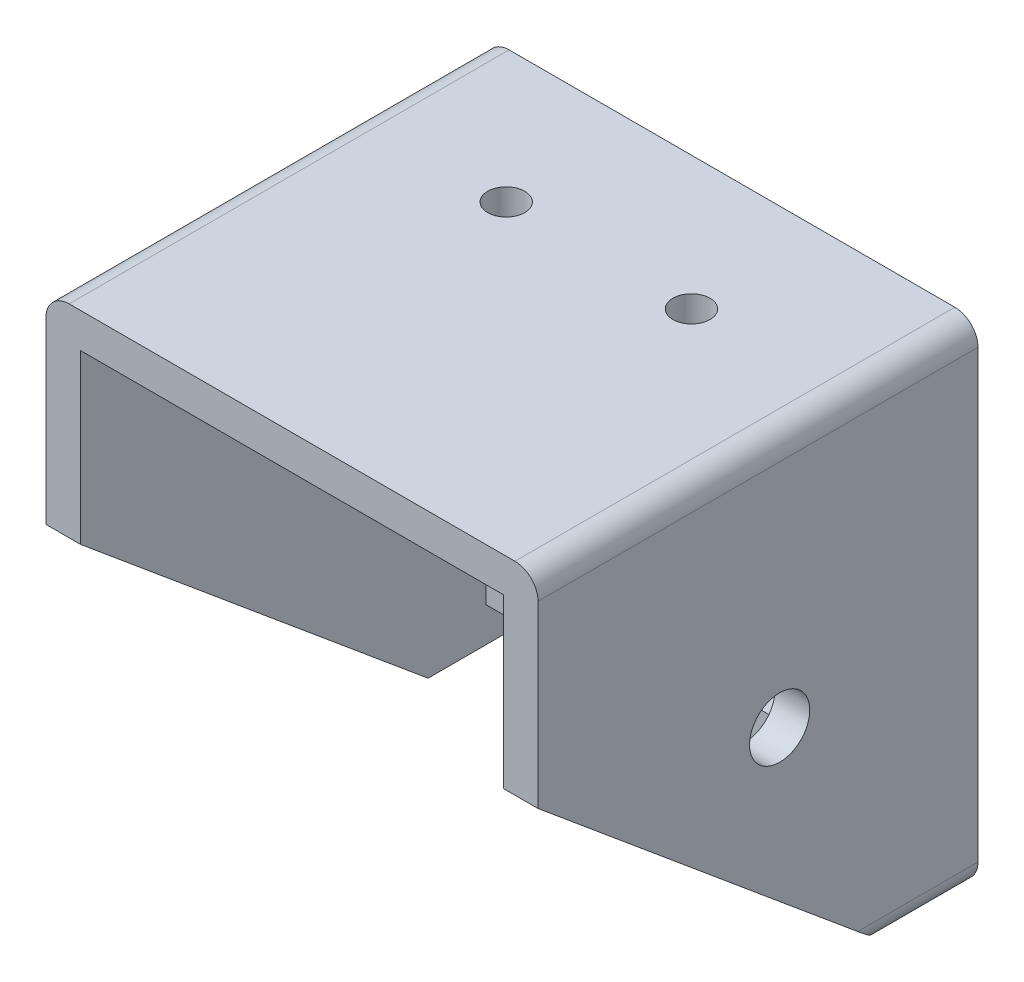
ISO-10303-21;
HEADER;
FILE_DESCRIPTION(('STEP AP214'),'2;1');
FILE_NAME('part.step','',(''),(''),'','','');
FILE_SCHEMA(('AUTOMOTIVE_DESIGN { 1 0 10303 214 1 1 1 1 }'));
ENDSEC;
DATA;
#1=APPLICATION_CONTEXT('core data for automotive mechanical design processes');
#2=APPLICATION_PROTOCOL_DEFINITION('international standard','automotive_design',2000,#1);
#3=PRODUCT_CONTEXT('',#1,'mechanical');
#4=PRODUCT('Part','Part','',(#3));
#5=PRODUCT_RELATED_PRODUCT_CATEGORY('part','',(#4));
#6=PRODUCT_DEFINITION_FORMATION('','',#4);
#7=PRODUCT_DEFINITION_CONTEXT('part definition',#1,'design');
#8=PRODUCT_DEFINITION('design','',#6,#7);
#9=PRODUCT_DEFINITION_SHAPE('','',#8);
#10=(LENGTH_UNIT() NAMED_UNIT(*) SI_UNIT(.MILLI.,.METRE.));
#11=(NAMED_UNIT(*) PLANE_ANGLE_UNIT() SI_UNIT($,.RADIAN.));
#12=(NAMED_UNIT(*) SI_UNIT($,.STERADIAN.) SOLID_ANGLE_UNIT());
#13=UNCERTAINTY_MEASURE_WITH_UNIT(LENGTH_MEASURE(1.E-05),#10,'distance_accuracy_value','');
#14=(GEOMETRIC_REPRESENTATION_CONTEXT(3) GLOBAL_UNCERTAINTY_ASSIGNED_CONTEXT((#13)) GLOBAL_UNIT_ASSIGNED_CONTEXT((#10,
#11,#12)) REPRESENTATION_CONTEXT('',''));
#15=CARTESIAN_POINT('',(0.,0.,0.));
#16=DIRECTION('',(0.,0.,1.));
#17=DIRECTION('',(1.,0.,0.));
#18=AXIS2_PLACEMENT_3D('',#15,#16,#17);
#19=CARTESIAN_POINT('',(29.5,-7.,3.));
#20=DIRECTION('',(0.,1.,0.));
#21=DIRECTION('',(0.,0.,1.));
#22=AXIS2_PLACEMENT_3D('',#19,#20,#21);
#23=PLANE('',#22);
#24=DIRECTION('',(0.,0.,-1.));
#25=VECTOR('',#24,1.);
#26=CARTESIAN_POINT('',(-4.99999999999999,-7.00000000000001,3.));
#27=LINE('',#26,#25);
#28=CARTESIAN_POINT('',(-4.99999999999999,-7.00000000000001,7.99999999999999));
#29=VERTEX_POINT('',#28);
#30=CARTESIAN_POINT('',(-4.99999999999999,-7.00000000000001,0.));
#31=VERTEX_POINT('',#30);
#32=EDGE_CURVE('E372',#29,#31,#27,.T.);
#33=ORIENTED_EDGE('',*,*,#32,.F.);
#34=DIRECTION('',(-1.,0.,0.));
#35=VECTOR('',#34,1.);
#36=CARTESIAN_POINT('',(37.,-7.,8.));
#37=LINE('',#36,#35);
#38=CARTESIAN_POINT('',(-6.,-7.,8.));
#39=VERTEX_POINT('',#38);
#40=EDGE_CURVE('E276',#29,#39,#37,.T.);
#41=ORIENTED_EDGE('',*,*,#40,.T.);
#42=DIRECTION('',(0.,0.,-1.));
#43=VECTOR('',#42,1.);
#44=CARTESIAN_POINT('',(-6.,-7.,3.));
#45=LINE('',#44,#43);
#46=CARTESIAN_POINT('',(-6.,-7.,0.));
#47=VERTEX_POINT('',#46);
#48=EDGE_CURVE('E228',#39,#47,#45,.T.);
#49=ORIENTED_EDGE('',*,*,#48,.T.);
#50=DIRECTION('',(1.,0.,0.));
#51=VECTOR('',#50,1.);
#52=CARTESIAN_POINT('',(29.5,-7.,0.));
#53=LINE('',#52,#51);
#54=EDGE_CURVE('E204',#47,#31,#53,.T.);
#55=ORIENTED_EDGE('',*,*,#54,.T.);
#56=EDGE_LOOP('',(#33,#41,#49,#55));
#57=FACE_BOUND('',#56,.T.);
#58=ADVANCED_FACE('F35',(#57),#23,.F.);
#59=CARTESIAN_POINT('',(37.,-7.,8.));
#60=DIRECTION('',(0.,0.768221279597376,-0.64018439966448));
#61=DIRECTION('',(0.,0.64018439966448,0.768221279597376));
#62=AXIS2_PLACEMENT_3D('',#59,#60,#61);
#63=PLANE('',#62);
#64=ORIENTED_EDGE('',*,*,#40,.F.);
#65=DIRECTION('',(0.,0.64018439966448,0.768221279597376));
#66=VECTOR('',#65,1.);
#67=CARTESIAN_POINT('',(-4.99999999999999,8.98360655737705,27.1803278688525));
#68=LINE('',#67,#66);
#69=CARTESIAN_POINT('',(-4.99999999999999,18.,38.));
#70=VERTEX_POINT('',#69);
#71=EDGE_CURVE('E275',#29,#70,#68,.T.);
#72=ORIENTED_EDGE('',*,*,#71,.T.);
#73=DIRECTION('',(-1.,0.,0.));
#74=VECTOR('',#73,1.);
#75=CARTESIAN_POINT('',(37.,18.,38.));
#76=LINE('',#75,#74);
#77=CARTESIAN_POINT('',(-8.,18.,38.));
#78=VERTEX_POINT('',#77);
#79=EDGE_CURVE('E273',#70,#78,#76,.T.);
#80=ORIENTED_EDGE('',*,*,#79,.T.);
#81=DIRECTION('',(0.,-0.64018439966448,-0.768221279597376));
#82=VECTOR('',#81,1.);
#83=CARTESIAN_POINT('',(-8.,-7.,8.));
#84=LINE('',#83,#82);
#85=CARTESIAN_POINT('',(-8.,-5.,10.4));
#86=VERTEX_POINT('',#85);
#87=EDGE_CURVE('E225',#78,#86,#84,.T.);
#88=ORIENTED_EDGE('',*,*,#87,.T.);
#89=CARTESIAN_POINT('',(-6.,-5.,10.4));
#90=DIRECTION('',(0.,0.768221279597376,-0.64018439966448));
#91=DIRECTION('',(0.,-0.64018439966448,-0.768221279597376));
#92=AXIS2_PLACEMENT_3D('',#89,#90,#91);
#93=ELLIPSE('',#92,3.12409987036266,2.);
#94=EDGE_CURVE('E245',#86,#39,#93,.F.);
#95=ORIENTED_EDGE('',*,*,#94,.T.);
#96=EDGE_LOOP('',(#64,#72,#80,#88,#95));
#97=FACE_BOUND('',#96,.T.);
#98=ADVANCED_FACE('F366',(#97),#63,.F.);
#99=CARTESIAN_POINT('',(0.,0.,3.));
#100=DIRECTION('',(0.,0.,1.));
#101=DIRECTION('',(1.,0.,0.));
#102=AXIS2_PLACEMENT_3D('',#99,#100,#101);
#103=PLANE('',#102);
#104=DIRECTION('',(0.,1.,0.));
#105=VECTOR('',#104,1.);
#106=CARTESIAN_POINT('',(31.5,32.5,3.));
#107=LINE('',#106,#105);
#108=CARTESIAN_POINT('',(31.5,-4.00000000000001,3.));
#109=VERTEX_POINT('',#108);
#110=CARTESIAN_POINT('',(31.5,32.5,3.));
#111=VERTEX_POINT('',#110);
#112=EDGE_CURVE('E190',#109,#111,#107,.T.);
#113=ORIENTED_EDGE('',*,*,#112,.T.);
#114=DIRECTION('',(-1.,0.,0.));
#115=VECTOR('',#114,1.);
#116=CARTESIAN_POINT('',(-4.99999999999999,32.5,3.));
#117=LINE('',#116,#115);
#118=CARTESIAN_POINT('',(-4.99999999999999,32.5,3.));
#119=VERTEX_POINT('',#118);
#120=EDGE_CURVE('E296',#111,#119,#117,.T.);
#121=ORIENTED_EDGE('',*,*,#120,.T.);
#122=DIRECTION('',(0.,-1.,0.));
#123=VECTOR('',#122,1.);
#124=CARTESIAN_POINT('',(-4.99999999999999,-4.00000000000001,3.));
#125=LINE('',#124,#123);
#126=CARTESIAN_POINT('',(-4.99999999999999,-4.00000000000001,3.));
#127=VERTEX_POINT('',#126);
#128=EDGE_CURVE('E298',#119,#127,#125,.T.);
#129=ORIENTED_EDGE('',*,*,#128,.T.);
#130=DIRECTION('',(1.,0.,0.));
#131=VECTOR('',#130,1.);
#132=CARTESIAN_POINT('',(31.5,-4.,3.));
#133=LINE('',#132,#131);
#134=EDGE_CURVE('E289',#127,#109,#133,.T.);
#135=ORIENTED_EDGE('',*,*,#134,.T.);
#136=EDGE_LOOP('',(#113,#121,#129,#135));
#137=FACE_BOUND('',#136,.T.);
#138=CARTESIAN_POINT('',(23.25,25.5,3.));
#139=DIRECTION('',(0.,0.,1.));
#140=DIRECTION('',(1.,0.,0.));
#141=AXIS2_PLACEMENT_3D('',#138,#139,#140);
#142=CIRCLE('',#141,6.);
#143=CARTESIAN_POINT('',(29.25,25.5,3.));
#144=VERTEX_POINT('',#143);
#145=EDGE_CURVE('E221',#144,#144,#142,.T.);
#146=ORIENTED_EDGE('',*,*,#145,.F.);
#147=EDGE_LOOP('',(#146));
#148=FACE_BOUND('',#147,.T.);
#149=CARTESIAN_POINT('',(3.25,25.5,3.));
#150=DIRECTION('',(0.,0.,1.));
#151=DIRECTION('',(1.,0.,0.));
#152=AXIS2_PLACEMENT_3D('',#149,#150,#151);
#153=CIRCLE('',#152,6.);
#154=CARTESIAN_POINT('',(9.25,25.5,3.));
#155=VERTEX_POINT('',#154);
#156=EDGE_CURVE('E217',#155,#155,#153,.T.);
#157=ORIENTED_EDGE('',*,*,#156,.F.);
#158=EDGE_LOOP('',(#157));
#159=FACE_BOUND('',#158,.T.);
#160=DIRECTION('',(0.,1.,0.));
#161=VECTOR('',#160,1.);
#162=CARTESIAN_POINT('',(26.5,14.5,3.));
#163=LINE('',#162,#161);
#164=CARTESIAN_POINT('',(26.5,0.,3.));
#165=VERTEX_POINT('',#164);
#166=CARTESIAN_POINT('',(26.5,14.5,3.));
#167=VERTEX_POINT('',#166);
#168=EDGE_CURVE('E318',#165,#167,#163,.T.);
#169=ORIENTED_EDGE('',*,*,#168,.F.);
#170=DIRECTION('',(1.,0.,0.));
#171=VECTOR('',#170,1.);
#172=CARTESIAN_POINT('',(0.,0.,3.));
#173=LINE('',#172,#171);
#174=CARTESIAN_POINT('',(0.,0.,3.));
#175=VERTEX_POINT('',#174);
#176=EDGE_CURVE('E316',#175,#165,#173,.T.);
#177=ORIENTED_EDGE('',*,*,#176,.F.);
#178=DIRECTION('',(0.,-1.,0.));
#179=VECTOR('',#178,1.);
#180=CARTESIAN_POINT('',(0.,0.,3.));
#181=LINE('',#180,#179);
#182=CARTESIAN_POINT('',(0.,14.5,3.));
#183=VERTEX_POINT('',#182);
#184=EDGE_CURVE('E324',#183,#175,#181,.T.);
#185=ORIENTED_EDGE('',*,*,#184,.F.);
#186=DIRECTION('',(-1.,0.,0.));
#187=VECTOR('',#186,1.);
#188=CARTESIAN_POINT('',(0.,14.5,3.));
#189=LINE('',#188,#187);
#190=EDGE_CURVE('E321',#167,#183,#189,.T.);
#191=ORIENTED_EDGE('',*,*,#190,.F.);
#192=EDGE_LOOP('',(#169,#177,#185,#191));
#193=FACE_BOUND('',#192,.T.);
#194=ADVANCED_FACE('F389',(#137,#148,#159,#193),#103,.T.);
#195=CARTESIAN_POINT('',(0.,0.,0.));
#196=DIRECTION('',(0.,0.,1.));
#197=DIRECTION('',(1.,0.,0.));
#198=AXIS2_PLACEMENT_3D('',#195,#196,#197);
#199=PLANE('',#198);
#200=CARTESIAN_POINT('',(23.25,25.5,0.));
#201=DIRECTION('',(0.,0.,1.));
#202=DIRECTION('',(1.,0.,0.));
#203=AXIS2_PLACEMENT_3D('',#200,#201,#202);
#204=CIRCLE('',#203,6.);
#205=CARTESIAN_POINT('',(29.25,25.5,0.));
#206=VERTEX_POINT('',#205);
#207=EDGE_CURVE('E218',#206,#206,#204,.T.);
#208=ORIENTED_EDGE('',*,*,#207,.T.);
#209=EDGE_LOOP('',(#208));
#210=FACE_BOUND('',#209,.T.);
#211=CARTESIAN_POINT('',(3.25,25.5,0.));
#212=DIRECTION('',(0.,0.,1.));
#213=DIRECTION('',(1.,0.,0.));
#214=AXIS2_PLACEMENT_3D('',#211,#212,#213);
#215=CIRCLE('',#214,6.);
#216=CARTESIAN_POINT('',(9.25,25.5,0.));
#217=VERTEX_POINT('',#216);
#218=EDGE_CURVE('E213',#217,#217,#215,.T.);
#219=ORIENTED_EDGE('',*,*,#218,.T.);
#220=EDGE_LOOP('',(#219));
#221=FACE_BOUND('',#220,.T.);
#222=ORIENTED_EDGE('',*,*,#54,.F.);
#223=CARTESIAN_POINT('',(-6.,-5.,0.));
#224=DIRECTION('',(0.,0.,1.));
#225=DIRECTION('',(1.,0.,0.));
#226=AXIS2_PLACEMENT_3D('',#223,#224,#225);
#227=CIRCLE('',#226,2.);
#228=CARTESIAN_POINT('',(-8.,-5.,0.));
#229=VERTEX_POINT('',#228);
#230=EDGE_CURVE('E236',#47,#229,#227,.F.);
#231=ORIENTED_EDGE('',*,*,#230,.T.);
#232=DIRECTION('',(0.,-1.,0.));
#233=VECTOR('',#232,1.);
#234=CARTESIAN_POINT('',(-8.,35.5,0.));
#235=LINE('',#234,#233);
#236=CARTESIAN_POINT('',(-8.,33.5,0.));
#237=VERTEX_POINT('',#236);
#238=EDGE_CURVE('E205',#237,#229,#235,.T.);
#239=ORIENTED_EDGE('',*,*,#238,.F.);
#240=CARTESIAN_POINT('',(-6.,33.5,0.));
#241=DIRECTION('',(0.,0.,1.));
#242=DIRECTION('',(1.,0.,0.));
#243=AXIS2_PLACEMENT_3D('',#240,#241,#242);
#244=CIRCLE('',#243,2.);
#245=CARTESIAN_POINT('',(-6.,35.5,0.));
#246=VERTEX_POINT('',#245);
#247=EDGE_CURVE('E233',#237,#246,#244,.F.);
#248=ORIENTED_EDGE('',*,*,#247,.T.);
#249=DIRECTION('',(-1.,0.,0.));
#250=VECTOR('',#249,1.);
#251=CARTESIAN_POINT('',(-3.,35.5,0.));
#252=LINE('',#251,#250);
#253=CARTESIAN_POINT('',(32.5,35.5,0.));
#254=VERTEX_POINT('',#253);
#255=EDGE_CURVE('E209',#254,#246,#252,.T.);
#256=ORIENTED_EDGE('',*,*,#255,.F.);
#257=CARTESIAN_POINT('',(32.5,33.5,0.));
#258=DIRECTION('',(0.,0.,1.));
#259=DIRECTION('',(1.,0.,0.));
#260=AXIS2_PLACEMENT_3D('',#257,#258,#259);
#261=CIRCLE('',#260,2.);
#262=CARTESIAN_POINT('',(34.5,33.5,0.));
#263=VERTEX_POINT('',#262);
#264=EDGE_CURVE('E231',#254,#263,#261,.F.);
#265=ORIENTED_EDGE('',*,*,#264,.T.);
#266=DIRECTION('',(0.,1.,0.));
#267=VECTOR('',#266,1.);
#268=CARTESIAN_POINT('',(34.5,-7.,0.));
#269=LINE('',#268,#267);
#270=CARTESIAN_POINT('',(34.5,-5.,0.));
#271=VERTEX_POINT('',#270);
#272=EDGE_CURVE('E346',#271,#263,#269,.T.);
#273=ORIENTED_EDGE('',*,*,#272,.F.);
#274=CARTESIAN_POINT('',(32.5,-5.,0.));
#275=DIRECTION('',(0.,0.,1.));
#276=DIRECTION('',(1.,0.,0.));
#277=AXIS2_PLACEMENT_3D('',#274,#275,#276);
#278=CIRCLE('',#277,2.);
#279=CARTESIAN_POINT('',(32.5,-7.,0.));
#280=VERTEX_POINT('',#279);
#281=EDGE_CURVE('E202',#271,#280,#278,.F.);
#282=ORIENTED_EDGE('',*,*,#281,.T.);
#283=CARTESIAN_POINT('',(31.5,-7.00000000000001,0.));
#284=VERTEX_POINT('',#283);
#285=EDGE_CURVE('E194',#284,#280,#53,.T.);
#286=ORIENTED_EDGE('',*,*,#285,.F.);
#287=DIRECTION('',(-1.,0.,0.));
#288=VECTOR('',#287,1.);
#289=CARTESIAN_POINT('',(31.5,-7.00000000000001,0.));
#290=LINE('',#289,#288);
#291=EDGE_CURVE('E168',#284,#31,#290,.T.);
#292=ORIENTED_EDGE('',*,*,#291,.T.);
#293=EDGE_LOOP('',(#222,#231,#239,#248,#256,#265,#273,#282,#286,#292));
#294=FACE_BOUND('',#293,.T.);
#295=DIRECTION('',(1.,0.,0.));
#296=VECTOR('',#295,1.);
#297=CARTESIAN_POINT('',(0.,0.,0.));
#298=LINE('',#297,#296);
#299=CARTESIAN_POINT('',(0.,0.,0.));
#300=VERTEX_POINT('',#299);
#301=CARTESIAN_POINT('',(26.5,0.,0.));
#302=VERTEX_POINT('',#301);
#303=EDGE_CURVE('E216',#300,#302,#298,.T.);
#304=ORIENTED_EDGE('',*,*,#303,.T.);
#305=DIRECTION('',(0.,1.,0.));
#306=VECTOR('',#305,1.);
#307=CARTESIAN_POINT('',(26.5,14.5,0.));
#308=LINE('',#307,#306);
#309=CARTESIAN_POINT('',(26.5,14.5,0.));
#310=VERTEX_POINT('',#309);
#311=EDGE_CURVE('E329',#302,#310,#308,.T.);
#312=ORIENTED_EDGE('',*,*,#311,.T.);
#313=DIRECTION('',(-1.,0.,0.));
#314=VECTOR('',#313,1.);
#315=CARTESIAN_POINT('',(0.,14.5,0.));
#316=LINE('',#315,#314);
#317=CARTESIAN_POINT('',(0.,14.5,0.));
#318=VERTEX_POINT('',#317);
#319=EDGE_CURVE('E332',#310,#318,#316,.T.);
#320=ORIENTED_EDGE('',*,*,#319,.T.);
#321=DIRECTION('',(0.,-1.,0.));
#322=VECTOR('',#321,1.);
#323=CARTESIAN_POINT('',(0.,0.,0.));
#324=LINE('',#323,#322);
#325=EDGE_CURVE('E319',#318,#300,#324,.T.);
#326=ORIENTED_EDGE('',*,*,#325,.T.);
#327=EDGE_LOOP('',(#304,#312,#320,#326));
#328=FACE_BOUND('',#327,.T.);
#329=ADVANCED_FACE('F199',(#210,#221,#294,#328),#199,.F.);
#330=CARTESIAN_POINT('',(34.5,-7.,3.));
#331=DIRECTION('',(-1.,0.,0.));
#332=DIRECTION('',(0.,0.,1.));
#333=AXIS2_PLACEMENT_3D('',#330,#331,#332);
#334=PLANE('',#333);
#335=CARTESIAN_POINT('',(34.5,13.6272072376241,17.1321493333356));
#336=DIRECTION('',(1.,0.,0.));
#337=DIRECTION('',(0.,0.,-1.));
#338=AXIS2_PLACEMENT_3D('',#335,#336,#337);
#339=CIRCLE('',#338,2.6);
#340=CARTESIAN_POINT('',(34.5,13.6272072376241,14.5321493333356));
#341=VERTEX_POINT('',#340);
#342=EDGE_CURVE('E226',#341,#341,#339,.T.);
#343=ORIENTED_EDGE('',*,*,#342,.F.);
#344=EDGE_LOOP('',(#343));
#345=FACE_BOUND('',#344,.T.);
#346=DIRECTION('',(0.,-0.64018439966448,-0.768221279597376));
#347=VECTOR('',#346,1.);
#348=CARTESIAN_POINT('',(34.5,-9.45901639344262,5.04918032786885));
#349=LINE('',#348,#347);
#350=CARTESIAN_POINT('',(34.5,18.,38.));
#351=VERTEX_POINT('',#350);
#352=CARTESIAN_POINT('',(34.5,-5.,10.4));
#353=VERTEX_POINT('',#352);
#354=EDGE_CURVE('E283',#351,#353,#349,.T.);
#355=ORIENTED_EDGE('',*,*,#354,.T.);
#356=DIRECTION('',(0.,0.,-1.));
#357=VECTOR('',#356,1.);
#358=CARTESIAN_POINT('',(34.5,-5.,3.));
#359=LINE('',#358,#357);
#360=EDGE_CURVE('E250',#353,#271,#359,.T.);
#361=ORIENTED_EDGE('',*,*,#360,.T.);
#362=ORIENTED_EDGE('',*,*,#272,.T.);
#363=DIRECTION('',(0.,0.,-1.));
#364=VECTOR('',#363,1.);
#365=CARTESIAN_POINT('',(34.5,33.5,3.));
#366=LINE('',#365,#364);
#367=CARTESIAN_POINT('',(34.5,33.5,38.));
#368=VERTEX_POINT('',#367);
#369=EDGE_CURVE('E248',#263,#368,#366,.F.);
#370=ORIENTED_EDGE('',*,*,#369,.T.);
#371=DIRECTION('',(0.,1.,0.));
#372=VECTOR('',#371,1.);
#373=CARTESIAN_POINT('',(34.5,-7.,38.));
#374=LINE('',#373,#372);
#375=EDGE_CURVE('E310',#351,#368,#374,.T.);
#376=ORIENTED_EDGE('',*,*,#375,.F.);
#377=EDGE_LOOP('',(#355,#361,#362,#370,#376));
#378=FACE_BOUND('',#377,.T.);
#379=ADVANCED_FACE('F442',(#345,#378),#334,.F.);
#380=CARTESIAN_POINT('',(-3.,35.5,3.));
#381=DIRECTION('',(0.,-1.,0.));
#382=DIRECTION('',(0.,0.,-1.));
#383=AXIS2_PLACEMENT_3D('',#380,#381,#382);
#384=PLANE('',#383);
#385=CARTESIAN_POINT('',(5.25,35.5,11.5));
#386=DIRECTION('',(0.,1.,0.));
#387=DIRECTION('',(0.,0.,1.));
#388=AXIS2_PLACEMENT_3D('',#385,#386,#387);
#389=CIRCLE('',#388,1.6);
#390=CARTESIAN_POINT('',(5.25,35.5,13.1));
#391=VERTEX_POINT('',#390);
#392=EDGE_CURVE('E179',#391,#391,#389,.T.);
#393=ORIENTED_EDGE('',*,*,#392,.F.);
#394=EDGE_LOOP('',(#393));
#395=FACE_BOUND('',#394,.T.);
#396=CARTESIAN_POINT('',(21.25,35.5,11.5));
#397=DIRECTION('',(0.,1.,0.));
#398=DIRECTION('',(0.,0.,1.));
#399=AXIS2_PLACEMENT_3D('',#396,#397,#398);
#400=CIRCLE('',#399,1.6);
#401=CARTESIAN_POINT('',(21.25,35.5,13.1));
#402=VERTEX_POINT('',#401);
#403=EDGE_CURVE('E259',#402,#402,#400,.T.);
#404=ORIENTED_EDGE('',*,*,#403,.F.);
#405=EDGE_LOOP('',(#404));
#406=FACE_BOUND('',#405,.T.);
#407=ORIENTED_EDGE('',*,*,#255,.T.);
#408=DIRECTION('',(0.,0.,-1.));
#409=VECTOR('',#408,1.);
#410=CARTESIAN_POINT('',(-6.,35.5,3.));
#411=LINE('',#410,#409);
#412=CARTESIAN_POINT('',(-6.,35.5,38.));
#413=VERTEX_POINT('',#412);
#414=EDGE_CURVE('E52',#246,#413,#411,.F.);
#415=ORIENTED_EDGE('',*,*,#414,.T.);
#416=DIRECTION('',(-1.,0.,0.));
#417=VECTOR('',#416,1.);
#418=CARTESIAN_POINT('',(34.5,35.5,38.));
#419=LINE('',#418,#417);
#420=CARTESIAN_POINT('',(32.5,35.5,38.));
#421=VERTEX_POINT('',#420);
#422=EDGE_CURVE('E306',#421,#413,#419,.T.);
#423=ORIENTED_EDGE('',*,*,#422,.F.);
#424=DIRECTION('',(0.,0.,-1.));
#425=VECTOR('',#424,1.);
#426=CARTESIAN_POINT('',(32.5,35.5,3.));
#427=LINE('',#426,#425);
#428=EDGE_CURVE('E253',#421,#254,#427,.T.);
#429=ORIENTED_EDGE('',*,*,#428,.T.);
#430=EDGE_LOOP('',(#407,#415,#423,#429));
#431=FACE_BOUND('',#430,.T.);
#432=ADVANCED_FACE('F349',(#395,#406,#431),#384,.F.);
#433=CARTESIAN_POINT('',(-8.,35.5,3.));
#434=DIRECTION('',(1.,0.,0.));
#435=DIRECTION('',(0.,0.,-1.));
#436=AXIS2_PLACEMENT_3D('',#433,#434,#435);
#437=PLANE('',#436);
#438=ORIENTED_EDGE('',*,*,#238,.T.);
#439=DIRECTION('',(0.,0.,-1.));
#440=VECTOR('',#439,1.);
#441=CARTESIAN_POINT('',(-8.,-5.,3.));
#442=LINE('',#441,#440);
#443=EDGE_CURVE('E241',#229,#86,#442,.F.);
#444=ORIENTED_EDGE('',*,*,#443,.T.);
#445=ORIENTED_EDGE('',*,*,#87,.F.);
#446=DIRECTION('',(0.,-1.,0.));
#447=VECTOR('',#446,1.);
#448=CARTESIAN_POINT('',(-8.,35.5,38.));
#449=LINE('',#448,#447);
#450=CARTESIAN_POINT('',(-8.,33.5,38.));
#451=VERTEX_POINT('',#450);
#452=EDGE_CURVE('E308',#451,#78,#449,.T.);
#453=ORIENTED_EDGE('',*,*,#452,.F.);
#454=DIRECTION('',(0.,0.,-1.));
#455=VECTOR('',#454,1.);
#456=CARTESIAN_POINT('',(-8.,33.5,3.));
#457=LINE('',#456,#455);
#458=EDGE_CURVE('E238',#451,#237,#457,.T.);
#459=ORIENTED_EDGE('',*,*,#458,.T.);
#460=EDGE_LOOP('',(#438,#444,#445,#453,#459));
#461=FACE_BOUND('',#460,.T.);
#462=ADVANCED_FACE('F360',(#461),#437,.F.);
#463=CARTESIAN_POINT('',(32.5,-7.,8.));
#464=VERTEX_POINT('',#463);
#465=CARTESIAN_POINT('',(31.5,-7.00000000000001,7.99999999999999));
#466=VERTEX_POINT('',#465);
#467=EDGE_CURVE('E197',#464,#466,#37,.T.);
#468=ORIENTED_EDGE('',*,*,#467,.T.);
#469=DIRECTION('',(0.,0.,-1.));
#470=VECTOR('',#469,1.);
#471=CARTESIAN_POINT('',(31.5,-7.00000000000001,3.));
#472=LINE('',#471,#470);
#473=EDGE_CURVE('E187',#466,#284,#472,.T.);
#474=ORIENTED_EDGE('',*,*,#473,.T.);
#475=ORIENTED_EDGE('',*,*,#285,.T.);
#476=DIRECTION('',(0.,0.,-1.));
#477=VECTOR('',#476,1.);
#478=CARTESIAN_POINT('',(32.5,-7.,3.));
#479=LINE('',#478,#477);
#480=EDGE_CURVE('E207',#280,#464,#479,.F.);
#481=ORIENTED_EDGE('',*,*,#480,.T.);
#482=EDGE_LOOP('',(#468,#474,#475,#481));
#483=FACE_BOUND('',#482,.T.);
#484=ADVANCED_FACE('F193',(#483),#23,.F.);
#485=CARTESIAN_POINT('',(0.,0.,3.));
#486=DIRECTION('',(0.,1.,0.));
#487=DIRECTION('',(0.,0.,1.));
#488=AXIS2_PLACEMENT_3D('',#485,#486,#487);
#489=PLANE('',#488);
#490=ORIENTED_EDGE('',*,*,#303,.F.);
#491=DIRECTION('',(0.,0.,-1.));
#492=VECTOR('',#491,1.);
#493=CARTESIAN_POINT('',(0.,0.,3.));
#494=LINE('',#493,#492);
#495=EDGE_CURVE('E326',#175,#300,#494,.T.);
#496=ORIENTED_EDGE('',*,*,#495,.F.);
#497=ORIENTED_EDGE('',*,*,#176,.T.);
#498=DIRECTION('',(0.,0.,-1.));
#499=VECTOR('',#498,1.);
#500=CARTESIAN_POINT('',(26.5,0.,3.));
#501=LINE('',#500,#499);
#502=EDGE_CURVE('E343',#165,#302,#501,.T.);
#503=ORIENTED_EDGE('',*,*,#502,.T.);
#504=EDGE_LOOP('',(#490,#496,#497,#503));
#505=FACE_BOUND('',#504,.T.);
#506=ADVANCED_FACE('F410',(#505),#489,.T.);
#507=CARTESIAN_POINT('',(26.5,14.5,3.));
#508=DIRECTION('',(-1.,0.,0.));
#509=DIRECTION('',(0.,0.,1.));
#510=AXIS2_PLACEMENT_3D('',#507,#508,#509);
#511=PLANE('',#510);
#512=ORIENTED_EDGE('',*,*,#311,.F.);
#513=ORIENTED_EDGE('',*,*,#502,.F.);
#514=ORIENTED_EDGE('',*,*,#168,.T.);
#515=DIRECTION('',(0.,0.,-1.));
#516=VECTOR('',#515,1.);
#517=CARTESIAN_POINT('',(26.5,14.5,3.));
#518=LINE('',#517,#516);
#519=EDGE_CURVE('E341',#167,#310,#518,.T.);
#520=ORIENTED_EDGE('',*,*,#519,.T.);
#521=EDGE_LOOP('',(#512,#513,#514,#520));
#522=FACE_BOUND('',#521,.T.);
#523=ADVANCED_FACE('F404',(#522),#511,.T.);
#524=CARTESIAN_POINT('',(0.,14.5,3.));
#525=DIRECTION('',(0.,-1.,0.));
#526=DIRECTION('',(0.,0.,-1.));
#527=AXIS2_PLACEMENT_3D('',#524,#525,#526);
#528=PLANE('',#527);
#529=ORIENTED_EDGE('',*,*,#319,.F.);
#530=ORIENTED_EDGE('',*,*,#519,.F.);
#531=ORIENTED_EDGE('',*,*,#190,.T.);
#532=DIRECTION('',(0.,0.,-1.));
#533=VECTOR('',#532,1.);
#534=CARTESIAN_POINT('',(0.,14.5,3.));
#535=LINE('',#534,#533);
#536=EDGE_CURVE('E339',#183,#318,#535,.T.);
#537=ORIENTED_EDGE('',*,*,#536,.T.);
#538=EDGE_LOOP('',(#529,#530,#531,#537));
#539=FACE_BOUND('',#538,.T.);
#540=ADVANCED_FACE('F407',(#539),#528,.T.);
#541=CARTESIAN_POINT('',(0.,0.,3.));
#542=DIRECTION('',(1.,0.,0.));
#543=DIRECTION('',(0.,0.,-1.));
#544=AXIS2_PLACEMENT_3D('',#541,#542,#543);
#545=PLANE('',#544);
#546=ORIENTED_EDGE('',*,*,#325,.F.);
#547=ORIENTED_EDGE('',*,*,#536,.F.);
#548=ORIENTED_EDGE('',*,*,#184,.T.);
#549=ORIENTED_EDGE('',*,*,#495,.T.);
#550=EDGE_LOOP('',(#546,#547,#548,#549));
#551=FACE_BOUND('',#550,.T.);
#552=ADVANCED_FACE('F413',(#551),#545,.T.);
#553=CARTESIAN_POINT('',(3.25,25.5,-17.));
#554=DIRECTION('',(0.,0.,1.));
#555=DIRECTION('',(1.,0.,0.));
#556=AXIS2_PLACEMENT_3D('',#553,#554,#555);
#557=CYLINDRICAL_SURFACE('',#556,6.);
#558=ORIENTED_EDGE('',*,*,#156,.T.);
#559=EDGE_LOOP('',(#558));
#560=FACE_BOUND('',#559,.T.);
#561=ORIENTED_EDGE('',*,*,#218,.F.);
#562=EDGE_LOOP('',(#561));
#563=FACE_BOUND('',#562,.T.);
#564=ADVANCED_FACE('F415',(#560,#563),#557,.F.);
#565=CARTESIAN_POINT('',(23.25,25.5,-17.));
#566=DIRECTION('',(0.,0.,1.));
#567=DIRECTION('',(1.,0.,0.));
#568=AXIS2_PLACEMENT_3D('',#565,#566,#567);
#569=CYLINDRICAL_SURFACE('',#568,6.);
#570=ORIENTED_EDGE('',*,*,#145,.T.);
#571=EDGE_LOOP('',(#570));
#572=FACE_BOUND('',#571,.T.);
#573=ORIENTED_EDGE('',*,*,#207,.F.);
#574=EDGE_LOOP('',(#573));
#575=FACE_BOUND('',#574,.T.);
#576=ADVANCED_FACE('F421',(#572,#575),#569,.F.);
#577=CARTESIAN_POINT('',(0.,0.,38.));
#578=DIRECTION('',(0.,0.,1.));
#579=DIRECTION('',(1.,0.,0.));
#580=AXIS2_PLACEMENT_3D('',#577,#578,#579);
#581=PLANE('',#580);
#582=ORIENTED_EDGE('',*,*,#422,.T.);
#583=CARTESIAN_POINT('',(-6.,33.5,38.));
#584=DIRECTION('',(0.,0.,1.));
#585=DIRECTION('',(1.,0.,0.));
#586=AXIS2_PLACEMENT_3D('',#583,#584,#585);
#587=CIRCLE('',#586,2.);
#588=EDGE_CURVE('E11',#413,#451,#587,.T.);
#589=ORIENTED_EDGE('',*,*,#588,.T.);
#590=ORIENTED_EDGE('',*,*,#452,.T.);
#591=ORIENTED_EDGE('',*,*,#79,.F.);
#592=DIRECTION('',(0.,-1.,0.));
#593=VECTOR('',#592,1.);
#594=CARTESIAN_POINT('',(-4.99999999999999,-4.00000000000001,38.));
#595=LINE('',#594,#593);
#596=CARTESIAN_POINT('',(-4.99999999999999,32.5,38.));
#597=VERTEX_POINT('',#596);
#598=EDGE_CURVE('E291',#597,#70,#595,.T.);
#599=ORIENTED_EDGE('',*,*,#598,.F.);
#600=DIRECTION('',(-1.,0.,0.));
#601=VECTOR('',#600,1.);
#602=CARTESIAN_POINT('',(-4.99999999999999,32.5,38.));
#603=LINE('',#602,#601);
#604=CARTESIAN_POINT('',(31.5,32.5,38.));
#605=VERTEX_POINT('',#604);
#606=EDGE_CURVE('E288',#605,#597,#603,.T.);
#607=ORIENTED_EDGE('',*,*,#606,.F.);
#608=DIRECTION('',(0.,1.,0.));
#609=VECTOR('',#608,1.);
#610=CARTESIAN_POINT('',(31.5,32.5,38.));
#611=LINE('',#610,#609);
#612=CARTESIAN_POINT('',(31.5,18.,38.));
#613=VERTEX_POINT('',#612);
#614=EDGE_CURVE('E286',#613,#605,#611,.T.);
#615=ORIENTED_EDGE('',*,*,#614,.F.);
#616=EDGE_CURVE('E279',#351,#613,#76,.T.);
#617=ORIENTED_EDGE('',*,*,#616,.F.);
#618=ORIENTED_EDGE('',*,*,#375,.T.);
#619=CARTESIAN_POINT('',(32.5,33.5,38.));
#620=DIRECTION('',(0.,0.,1.));
#621=DIRECTION('',(1.,0.,0.));
#622=AXIS2_PLACEMENT_3D('',#619,#620,#621);
#623=CIRCLE('',#622,2.);
#624=EDGE_CURVE('E44',#368,#421,#623,.T.);
#625=ORIENTED_EDGE('',*,*,#624,.T.);
#626=EDGE_LOOP('',(#582,#589,#590,#591,#599,#607,#615,#617,#618,#625));
#627=FACE_BOUND('',#626,.T.);
#628=ADVANCED_FACE('F356',(#627),#581,.T.);
#629=CARTESIAN_POINT('',(31.5,32.5,38.));
#630=DIRECTION('',(-1.,0.,0.));
#631=DIRECTION('',(0.,-1.,0.));
#632=AXIS2_PLACEMENT_3D('',#629,#630,#631);
#633=PLANE('',#632);
#634=CARTESIAN_POINT('',(31.5,13.6272072376241,17.1321493333356));
#635=DIRECTION('',(-1.,0.,0.));
#636=DIRECTION('',(0.,-1.,0.));
#637=AXIS2_PLACEMENT_3D('',#634,#635,#636);
#638=CIRCLE('',#637,2.6);
#639=CARTESIAN_POINT('',(31.5,13.6272072376241,14.5321493333356));
#640=VERTEX_POINT('',#639);
#641=EDGE_CURVE('E222',#640,#640,#638,.T.);
#642=ORIENTED_EDGE('',*,*,#641,.F.);
#643=EDGE_LOOP('',(#642));
#644=FACE_BOUND('',#643,.T.);
#645=DIRECTION('',(0.,-0.64018439966448,-0.768221279597376));
#646=VECTOR('',#645,1.);
#647=CARTESIAN_POINT('',(31.5,23.9426229508197,45.1311475409836));
#648=LINE('',#647,#646);
#649=EDGE_CURVE('E281',#613,#466,#648,.T.);
#650=ORIENTED_EDGE('',*,*,#649,.F.);
#651=ORIENTED_EDGE('',*,*,#614,.T.);
#652=DIRECTION('',(0.,0.,-1.));
#653=VECTOR('',#652,1.);
#654=CARTESIAN_POINT('',(31.5,32.5,38.));
#655=LINE('',#654,#653);
#656=EDGE_CURVE('E304',#605,#111,#655,.T.);
#657=ORIENTED_EDGE('',*,*,#656,.T.);
#658=ORIENTED_EDGE('',*,*,#112,.F.);
#659=DIRECTION('',(0.,0.707106781186548,0.707106781186548));
#660=VECTOR('',#659,1.);
#661=CARTESIAN_POINT('',(31.5,-7.00000000000001,0.));
#662=LINE('',#661,#660);
#663=EDGE_CURVE('E172',#284,#109,#662,.T.);
#664=ORIENTED_EDGE('',*,*,#663,.F.);
#665=ORIENTED_EDGE('',*,*,#473,.F.);
#666=EDGE_LOOP('',(#650,#651,#657,#658,#664,#665));
#667=FACE_BOUND('',#666,.T.);
#668=ADVANCED_FACE('F186',(#644,#667),#633,.T.);
#669=CARTESIAN_POINT('',(-4.99999999999999,32.5,38.));
#670=DIRECTION('',(0.,-1.,0.));
#671=DIRECTION('',(0.,0.,-1.));
#672=AXIS2_PLACEMENT_3D('',#669,#670,#671);
#673=PLANE('',#672);
#674=CARTESIAN_POINT('',(5.25,32.5,11.5));
#675=DIRECTION('',(0.,-1.,0.));
#676=DIRECTION('',(0.,0.,-1.));
#677=AXIS2_PLACEMENT_3D('',#674,#675,#676);
#678=CIRCLE('',#677,1.6);
#679=CARTESIAN_POINT('',(5.25,32.5,9.9));
#680=VERTEX_POINT('',#679);
#681=EDGE_CURVE('E39',#680,#680,#678,.T.);
#682=ORIENTED_EDGE('',*,*,#681,.F.);
#683=EDGE_LOOP('',(#682));
#684=FACE_BOUND('',#683,.T.);
#685=CARTESIAN_POINT('',(21.25,32.5,11.5));
#686=DIRECTION('',(0.,-1.,0.));
#687=DIRECTION('',(0.,0.,-1.));
#688=AXIS2_PLACEMENT_3D('',#685,#686,#687);
#689=CIRCLE('',#688,1.6);
#690=CARTESIAN_POINT('',(21.25,32.5,9.9));
#691=VERTEX_POINT('',#690);
#692=EDGE_CURVE('E257',#691,#691,#689,.T.);
#693=ORIENTED_EDGE('',*,*,#692,.F.);
#694=EDGE_LOOP('',(#693));
#695=FACE_BOUND('',#694,.T.);
#696=ORIENTED_EDGE('',*,*,#120,.F.);
#697=ORIENTED_EDGE('',*,*,#656,.F.);
#698=ORIENTED_EDGE('',*,*,#606,.T.);
#699=DIRECTION('',(0.,0.,-1.));
#700=VECTOR('',#699,1.);
#701=CARTESIAN_POINT('',(-4.99999999999999,32.5,38.));
#702=LINE('',#701,#700);
#703=EDGE_CURVE('E294',#597,#119,#702,.T.);
#704=ORIENTED_EDGE('',*,*,#703,.T.);
#705=EDGE_LOOP('',(#696,#697,#698,#704));
#706=FACE_BOUND('',#705,.T.);
#707=ADVANCED_FACE('F384',(#684,#695,#706),#673,.T.);
#708=CARTESIAN_POINT('',(-4.99999999999999,-4.00000000000001,38.));
#709=DIRECTION('',(1.,0.,0.));
#710=DIRECTION('',(0.,0.,-1.));
#711=AXIS2_PLACEMENT_3D('',#708,#709,#710);
#712=PLANE('',#711);
#713=ORIENTED_EDGE('',*,*,#71,.F.);
#714=ORIENTED_EDGE('',*,*,#32,.T.);
#715=DIRECTION('',(0.,0.707106781186548,0.707106781186548));
#716=VECTOR('',#715,1.);
#717=CARTESIAN_POINT('',(-4.99999999999999,-7.00000000000001,0.));
#718=LINE('',#717,#716);
#719=EDGE_CURVE('E174',#31,#127,#718,.T.);
#720=ORIENTED_EDGE('',*,*,#719,.T.);
#721=ORIENTED_EDGE('',*,*,#128,.F.);
#722=ORIENTED_EDGE('',*,*,#703,.F.);
#723=ORIENTED_EDGE('',*,*,#598,.T.);
#724=EDGE_LOOP('',(#713,#714,#720,#721,#722,#723));
#725=FACE_BOUND('',#724,.T.);
#726=ADVANCED_FACE('F387',(#725),#712,.T.);
#727=ORIENTED_EDGE('',*,*,#649,.T.);
#728=ORIENTED_EDGE('',*,*,#467,.F.);
#729=CARTESIAN_POINT('',(32.5,-5.,10.4));
#730=DIRECTION('',(0.,0.768221279597376,-0.64018439966448));
#731=DIRECTION('',(0.,-0.64018439966448,-0.768221279597376));
#732=AXIS2_PLACEMENT_3D('',#729,#730,#731);
#733=ELLIPSE('',#732,3.12409987036266,2.);
#734=EDGE_CURVE('E243',#464,#353,#733,.F.);
#735=ORIENTED_EDGE('',*,*,#734,.T.);
#736=ORIENTED_EDGE('',*,*,#354,.F.);
#737=ORIENTED_EDGE('',*,*,#616,.T.);
#738=EDGE_LOOP('',(#727,#728,#735,#736,#737));
#739=FACE_BOUND('',#738,.T.);
#740=ADVANCED_FACE('F375',(#739),#63,.F.);
#741=CARTESIAN_POINT('',(8.49999999999999,13.6272072376241,17.1321493333356));
#742=DIRECTION('',(1.,0.,0.));
#743=DIRECTION('',(0.,0.,-1.));
#744=AXIS2_PLACEMENT_3D('',#741,#742,#743);
#745=CYLINDRICAL_SURFACE('',#744,2.6);
#746=CARTESIAN_POINT('',(31.5,13.6272072376241,14.5321493333356));
#747=CARTESIAN_POINT('',(31.53125,13.6272072376241,14.5321493333356));
#748=CARTESIAN_POINT('',(31.5625,13.6272072376241,14.5321493333356));
#749=CARTESIAN_POINT('',(31.625,13.6272072376241,14.5321493333356));
#750=CARTESIAN_POINT('',(31.65625,13.6272072376241,14.5321493333356));
#751=CARTESIAN_POINT('',(31.71875,13.6272072376241,14.5321493333356));
#752=CARTESIAN_POINT('',(31.75,13.6272072376241,14.5321493333356));
#753=CARTESIAN_POINT('',(31.8125,13.6272072376241,14.5321493333356));
#754=CARTESIAN_POINT('',(31.84375,13.6272072376241,14.5321493333356));
#755=CARTESIAN_POINT('',(31.90625,13.6272072376241,14.5321493333356));
#756=CARTESIAN_POINT('',(31.9375,13.6272072376241,14.5321493333356));
#757=CARTESIAN_POINT('',(32.,13.6272072376241,14.5321493333356));
#758=CARTESIAN_POINT('',(32.03125,13.6272072376241,14.5321493333356));
#759=CARTESIAN_POINT('',(32.09375,13.6272072376241,14.5321493333356));
#760=CARTESIAN_POINT('',(32.125,13.6272072376241,14.5321493333356));
#761=CARTESIAN_POINT('',(32.1875,13.6272072376241,14.5321493333356));
#762=CARTESIAN_POINT('',(32.21875,13.6272072376241,14.5321493333356));
#763=CARTESIAN_POINT('',(32.28125,13.6272072376241,14.5321493333356));
#764=CARTESIAN_POINT('',(32.3125,13.6272072376241,14.5321493333356));
#765=CARTESIAN_POINT('',(32.375,13.6272072376241,14.5321493333356));
#766=CARTESIAN_POINT('',(32.40625,13.6272072376241,14.5321493333356));
#767=CARTESIAN_POINT('',(32.46875,13.6272072376241,14.5321493333356));
#768=CARTESIAN_POINT('',(32.5,13.6272072376241,14.5321493333356));
#769=CARTESIAN_POINT('',(32.5625,13.6272072376241,14.5321493333356));
#770=CARTESIAN_POINT('',(32.59375,13.6272072376241,14.5321493333356));
#771=CARTESIAN_POINT('',(32.65625,13.6272072376241,14.5321493333356));
#772=CARTESIAN_POINT('',(32.6875,13.6272072376241,14.5321493333356));
#773=CARTESIAN_POINT('',(32.75,13.6272072376241,14.5321493333356));
#774=CARTESIAN_POINT('',(32.78125,13.6272072376241,14.5321493333356));
#775=CARTESIAN_POINT('',(32.84375,13.6272072376241,14.5321493333356));
#776=CARTESIAN_POINT('',(32.875,13.6272072376241,14.5321493333356));
#777=CARTESIAN_POINT('',(32.9375,13.6272072376241,14.5321493333356));
#778=CARTESIAN_POINT('',(32.96875,13.6272072376241,14.5321493333356));
#779=CARTESIAN_POINT('',(33.03125,13.6272072376241,14.5321493333356));
#780=CARTESIAN_POINT('',(33.0625,13.6272072376241,14.5321493333356));
#781=CARTESIAN_POINT('',(33.125,13.6272072376241,14.5321493333356));
#782=CARTESIAN_POINT('',(33.15625,13.6272072376241,14.5321493333356));
#783=CARTESIAN_POINT('',(33.21875,13.6272072376241,14.5321493333356));
#784=CARTESIAN_POINT('',(33.25,13.6272072376241,14.5321493333356));
#785=CARTESIAN_POINT('',(33.3125,13.6272072376241,14.5321493333356));
#786=CARTESIAN_POINT('',(33.34375,13.6272072376241,14.5321493333356));
#787=CARTESIAN_POINT('',(33.40625,13.6272072376241,14.5321493333356));
#788=CARTESIAN_POINT('',(33.4375,13.6272072376241,14.5321493333356));
#789=CARTESIAN_POINT('',(33.5,13.6272072376241,14.5321493333356));
#790=CARTESIAN_POINT('',(33.53125,13.6272072376241,14.5321493333356));
#791=CARTESIAN_POINT('',(33.59375,13.6272072376241,14.5321493333356));
#792=CARTESIAN_POINT('',(33.625,13.6272072376241,14.5321493333356));
#793=CARTESIAN_POINT('',(33.6875,13.6272072376241,14.5321493333356));
#794=CARTESIAN_POINT('',(33.71875,13.6272072376241,14.5321493333356));
#795=CARTESIAN_POINT('',(33.78125,13.6272072376241,14.5321493333356));
#796=CARTESIAN_POINT('',(33.8125,13.6272072376241,14.5321493333356));
#797=CARTESIAN_POINT('',(33.875,13.6272072376241,14.5321493333356));
#798=CARTESIAN_POINT('',(33.90625,13.6272072376241,14.5321493333356));
#799=CARTESIAN_POINT('',(33.96875,13.6272072376241,14.5321493333356));
#800=CARTESIAN_POINT('',(34.,13.6272072376241,14.5321493333356));
#801=CARTESIAN_POINT('',(34.0625,13.6272072376241,14.5321493333356));
#802=CARTESIAN_POINT('',(34.09375,13.6272072376241,14.5321493333356));
#803=CARTESIAN_POINT('',(34.15625,13.6272072376241,14.5321493333356));
#804=CARTESIAN_POINT('',(34.1875,13.6272072376241,14.5321493333356));
#805=CARTESIAN_POINT('',(34.25,13.6272072376241,14.5321493333356));
#806=CARTESIAN_POINT('',(34.28125,13.6272072376241,14.5321493333356));
#807=CARTESIAN_POINT('',(34.34375,13.6272072376241,14.5321493333356));
#808=CARTESIAN_POINT('',(34.375,13.6272072376241,14.5321493333356));
#809=CARTESIAN_POINT('',(34.4375,13.6272072376241,14.5321493333356));
#810=CARTESIAN_POINT('',(34.46875,13.6272072376241,14.5321493333356));
#811=CARTESIAN_POINT('',(34.5,13.6272072376241,14.5321493333356));
#812=B_SPLINE_CURVE_WITH_KNOTS('',3,(#746,#747,#748,#749,#750,#751,#752,#753,#754,#755,#756,
#757,#758,#759,#760,#761,#762,#763,#764,#765,#766,#767,#768,#769,#770,#771,#772,#773,#774,#775,
#776,#777,#778,#779,#780,#781,#782,#783,#784,#785,#786,#787,#788,#789,#790,#791,#792,#793,#794,
#795,#796,#797,#798,#799,#800,#801,#802,#803,#804,#805,#806,#807,#808,#809,#810,#811),
.UNSPECIFIED.,.F.,.F.,(4,2,2,2,2,2,2,2,2,2,2,2,2,2,2,2,2,2,2,2,2,2,2,2,2,2,2,2,2,2,2,2,4),(0.,
0.0937500000000036,0.187500000000007,0.281250000000004,0.375,0.468750000000004,0.5625,
0.656249999999997,0.750000000000001,0.843750000000004,0.937500000000001,1.03125,1.125,1.21875,
1.31249999999999,1.40625,1.5,1.59375,1.68749999999999,1.78125,1.875,1.96874999999999,
2.06249999999999,2.15625,2.25,2.34374999999999,2.4375,2.53125,2.62499999999999,2.71874999999999,
2.8125,2.90624999999999,2.99999999999999),.UNSPECIFIED.);
#813=EDGE_CURVE('BSEAM452',#640,#341,#812,.T.);
#814=ORIENTED_EDGE('',*,*,#641,.T.);
#815=ORIENTED_EDGE('',*,*,#342,.T.);
#816=ORIENTED_EDGE('',*,*,#813,.T.);
#817=ORIENTED_EDGE('',*,*,#813,.F.);
#818=EDGE_LOOP('',(#814,#816,#815,#817));
#819=FACE_BOUND('',#818,.T.);
#820=ADVANCED_FACE('F452',(#819),#745,.F.);
#821=CARTESIAN_POINT('',(-6.,-5.,3.));
#822=DIRECTION('',(0.,0.,-1.));
#823=DIRECTION('',(-1.,0.,0.));
#824=AXIS2_PLACEMENT_3D('',#821,#822,#823);
#825=CYLINDRICAL_SURFACE('',#824,2.);
#826=ORIENTED_EDGE('',*,*,#94,.F.);
#827=ORIENTED_EDGE('',*,*,#443,.F.);
#828=ORIENTED_EDGE('',*,*,#230,.F.);
#829=ORIENTED_EDGE('',*,*,#48,.F.);
#830=EDGE_LOOP('',(#826,#827,#828,#829));
#831=FACE_BOUND('',#830,.T.);
#832=ADVANCED_FACE('F369',(#831),#825,.T.);
#833=CARTESIAN_POINT('',(32.5,-5.,3.));
#834=DIRECTION('',(0.,0.,-1.));
#835=DIRECTION('',(-1.,0.,0.));
#836=AXIS2_PLACEMENT_3D('',#833,#834,#835);
#837=CYLINDRICAL_SURFACE('',#836,2.);
#838=ORIENTED_EDGE('',*,*,#734,.F.);
#839=ORIENTED_EDGE('',*,*,#480,.F.);
#840=ORIENTED_EDGE('',*,*,#281,.F.);
#841=ORIENTED_EDGE('',*,*,#360,.F.);
#842=EDGE_LOOP('',(#838,#839,#840,#841));
#843=FACE_BOUND('',#842,.T.);
#844=ADVANCED_FACE('F451',(#843),#837,.T.);
#845=CARTESIAN_POINT('',(-6.,33.5,3.));
#846=DIRECTION('',(0.,0.,-1.));
#847=DIRECTION('',(-1.,0.,0.));
#848=AXIS2_PLACEMENT_3D('',#845,#846,#847);
#849=CYLINDRICAL_SURFACE('',#848,2.);
#850=ORIENTED_EDGE('',*,*,#588,.F.);
#851=ORIENTED_EDGE('',*,*,#414,.F.);
#852=ORIENTED_EDGE('',*,*,#247,.F.);
#853=ORIENTED_EDGE('',*,*,#458,.F.);
#854=EDGE_LOOP('',(#850,#851,#852,#853));
#855=FACE_BOUND('',#854,.T.);
#856=ADVANCED_FACE('F353',(#855),#849,.T.);
#857=CARTESIAN_POINT('',(32.5,33.5,3.));
#858=DIRECTION('',(0.,0.,-1.));
#859=DIRECTION('',(-1.,0.,0.));
#860=AXIS2_PLACEMENT_3D('',#857,#858,#859);
#861=CYLINDRICAL_SURFACE('',#860,2.);
#862=ORIENTED_EDGE('',*,*,#624,.F.);
#863=ORIENTED_EDGE('',*,*,#369,.F.);
#864=ORIENTED_EDGE('',*,*,#264,.F.);
#865=ORIENTED_EDGE('',*,*,#428,.F.);
#866=EDGE_LOOP('',(#862,#863,#864,#865));
#867=FACE_BOUND('',#866,.T.);
#868=ADVANCED_FACE('F37',(#867),#861,.T.);
#869=CARTESIAN_POINT('',(21.25,26.5,11.5));
#870=DIRECTION('',(0.,1.,0.));
#871=DIRECTION('',(0.,0.,1.));
#872=AXIS2_PLACEMENT_3D('',#869,#870,#871);
#873=CYLINDRICAL_SURFACE('',#872,1.6);
#874=ORIENTED_EDGE('',*,*,#692,.T.);
#875=EDGE_LOOP('',(#874));
#876=FACE_BOUND('',#875,.T.);
#877=ORIENTED_EDGE('',*,*,#403,.T.);
#878=EDGE_LOOP('',(#877));
#879=FACE_BOUND('',#878,.T.);
#880=ADVANCED_FACE('F459',(#876,#879),#873,.F.);
#881=CARTESIAN_POINT('',(5.25,26.5,11.5));
#882=DIRECTION('',(0.,1.,0.));
#883=DIRECTION('',(0.,0.,1.));
#884=AXIS2_PLACEMENT_3D('',#881,#882,#883);
#885=CYLINDRICAL_SURFACE('',#884,1.6);
#886=ORIENTED_EDGE('',*,*,#681,.T.);
#887=EDGE_LOOP('',(#886));
#888=FACE_BOUND('',#887,.T.);
#889=ORIENTED_EDGE('',*,*,#392,.T.);
#890=EDGE_LOOP('',(#889));
#891=FACE_BOUND('',#890,.T.);
#892=ADVANCED_FACE('F464',(#888,#891),#885,.F.);
#893=CARTESIAN_POINT('',(31.5,-7.00000000000001,0.));
#894=DIRECTION('',(0.,-0.707106781186548,0.707106781186548));
#895=DIRECTION('',(0.,-0.707106781186548,-0.707106781186548));
#896=AXIS2_PLACEMENT_3D('',#893,#894,#895);
#897=PLANE('',#896);
#898=ORIENTED_EDGE('',*,*,#719,.F.);
#899=ORIENTED_EDGE('',*,*,#291,.F.);
#900=ORIENTED_EDGE('',*,*,#663,.T.);
#901=ORIENTED_EDGE('',*,*,#134,.F.);
#902=EDGE_LOOP('',(#898,#899,#900,#901));
#903=FACE_BOUND('',#902,.T.);
#904=ADVANCED_FACE('F170',(#903),#897,.T.);
#905=CLOSED_SHELL('',(#58,#98,#194,#329,#379,#432,#462,#484,#506,#523,#540,#552,#564,#576,#628,
#668,#707,#726,#740,#820,#832,#844,#856,#868,#880,#892,#904));
#906=MANIFOLD_SOLID_BREP('B2',#905);
#907=ADVANCED_BREP_SHAPE_REPRESENTATION('',(#18,#906),#14);
#908=SHAPE_DEFINITION_REPRESENTATION(#9,#907);
ENDSEC;
END-ISO-10303-21;
